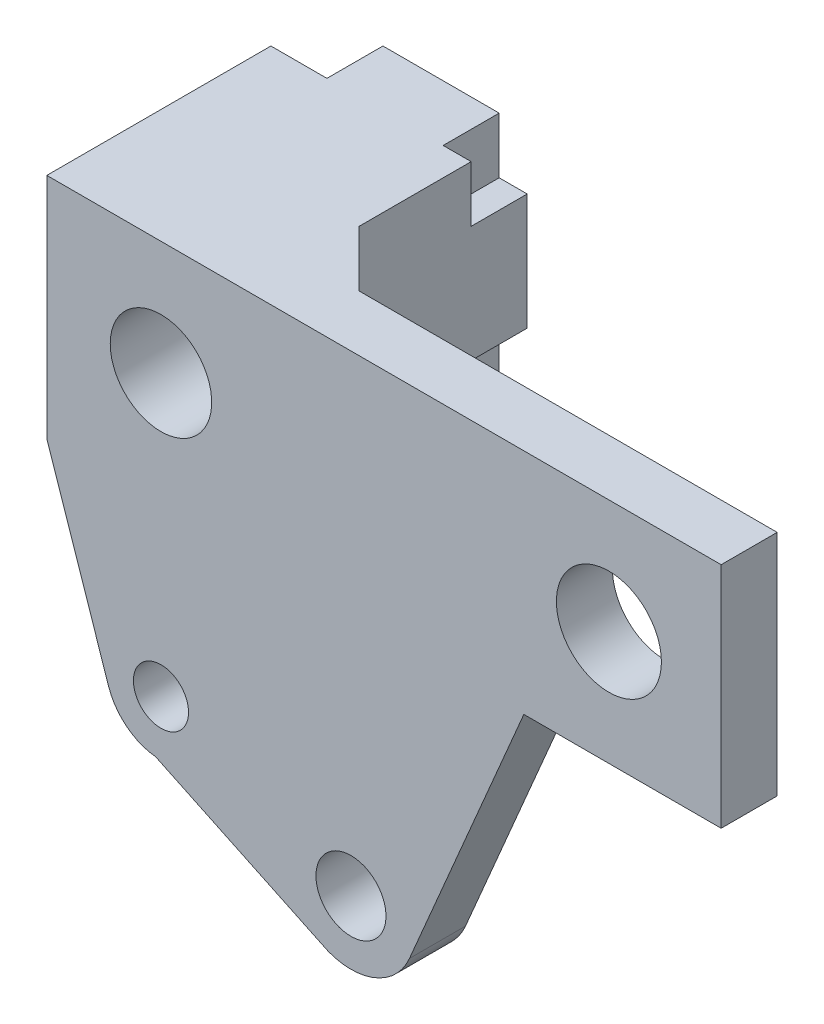
ISO-10303-21;
HEADER;
FILE_DESCRIPTION(('STEP AP214'),'2;1');
FILE_NAME('part.step','',(''),(''),'','','');
FILE_SCHEMA(('AUTOMOTIVE_DESIGN { 1 0 10303 214 1 1 1 1 }'));
ENDSEC;
DATA;
#1=APPLICATION_CONTEXT('core data for automotive mechanical design processes');
#2=APPLICATION_PROTOCOL_DEFINITION('international standard','automotive_design',2000,#1);
#3=PRODUCT_CONTEXT('',#1,'mechanical');
#4=PRODUCT('Part','Part','',(#3));
#5=PRODUCT_RELATED_PRODUCT_CATEGORY('part','',(#4));
#6=PRODUCT_DEFINITION_FORMATION('','',#4);
#7=PRODUCT_DEFINITION_CONTEXT('part definition',#1,'design');
#8=PRODUCT_DEFINITION('design','',#6,#7);
#9=PRODUCT_DEFINITION_SHAPE('','',#8);
#10=(LENGTH_UNIT() NAMED_UNIT(*) SI_UNIT(.MILLI.,.METRE.));
#11=(NAMED_UNIT(*) PLANE_ANGLE_UNIT() SI_UNIT($,.RADIAN.));
#12=(NAMED_UNIT(*) SI_UNIT($,.STERADIAN.) SOLID_ANGLE_UNIT());
#13=UNCERTAINTY_MEASURE_WITH_UNIT(LENGTH_MEASURE(1.E-05),#10,'distance_accuracy_value','');
#14=(GEOMETRIC_REPRESENTATION_CONTEXT(3) GLOBAL_UNCERTAINTY_ASSIGNED_CONTEXT((#13)) GLOBAL_UNIT_ASSIGNED_CONTEXT((#10,
#11,#12)) REPRESENTATION_CONTEXT('',''));
#15=CARTESIAN_POINT('',(0.,0.,0.));
#16=DIRECTION('',(0.,0.,1.));
#17=DIRECTION('',(1.,0.,0.));
#18=AXIS2_PLACEMENT_3D('',#15,#16,#17);
#19=CARTESIAN_POINT('',(0.,0.,0.));
#20=DIRECTION('',(0.,1.,0.));
#21=DIRECTION('',(0.,0.,1.));
#22=AXIS2_PLACEMENT_3D('',#19,#20,#21);
#23=PLANE('',#22);
#24=DIRECTION('',(1.,0.,0.));
#25=VECTOR('',#24,1.);
#26=CARTESIAN_POINT('',(0.,0.,0.));
#27=LINE('',#26,#25);
#28=CARTESIAN_POINT('',(43.2595043201598,0.,0.));
#29=VERTEX_POINT('',#28);
#30=CARTESIAN_POINT('',(61.1505,0.,0.));
#31=VERTEX_POINT('',#30);
#32=EDGE_CURVE('E210',#29,#31,#27,.T.);
#33=ORIENTED_EDGE('',*,*,#32,.F.);
#34=DIRECTION('',(0.,0.,1.));
#35=VECTOR('',#34,1.);
#36=CARTESIAN_POINT('',(43.2595043201598,0.,-5.08));
#37=LINE('',#36,#35);
#38=CARTESIAN_POINT('',(43.2595043201598,0.,-5.07999999999999));
#39=VERTEX_POINT('',#38);
#40=EDGE_CURVE('E254',#39,#29,#37,.T.);
#41=ORIENTED_EDGE('',*,*,#40,.F.);
#42=DIRECTION('',(-1.,0.,0.));
#43=VECTOR('',#42,1.);
#44=CARTESIAN_POINT('',(0.,0.,-5.07999999999999));
#45=LINE('',#44,#43);
#46=CARTESIAN_POINT('',(61.1505,0.,-5.08));
#47=VERTEX_POINT('',#46);
#48=EDGE_CURVE('E403',#47,#39,#45,.T.);
#49=ORIENTED_EDGE('',*,*,#48,.F.);
#50=DIRECTION('',(0.,0.,1.));
#51=VECTOR('',#50,1.);
#52=CARTESIAN_POINT('',(61.1505,0.,0.));
#53=LINE('',#52,#51);
#54=EDGE_CURVE('E225',#47,#31,#53,.T.);
#55=ORIENTED_EDGE('',*,*,#54,.T.);
#56=EDGE_LOOP('',(#33,#41,#49,#55));
#57=FACE_BOUND('',#56,.T.);
#58=ADVANCED_FACE('F39',(#57),#23,.F.);
#59=DIRECTION('',(1.,0.,0.));
#60=VECTOR('',#59,1.);
#61=CARTESIAN_POINT('',(0.,0.,-5.08));
#62=LINE('',#61,#60);
#63=CARTESIAN_POINT('',(0.,0.,-5.08));
#64=VERTEX_POINT('',#63);
#65=CARTESIAN_POINT('',(23.241,0.,-5.07999999999999));
#66=VERTEX_POINT('',#65);
#67=EDGE_CURVE('E368',#64,#66,#62,.T.);
#68=ORIENTED_EDGE('',*,*,#67,.F.);
#69=DIRECTION('',(0.,0.,-1.));
#70=VECTOR('',#69,1.);
#71=CARTESIAN_POINT('',(0.,0.,0.));
#72=LINE('',#71,#70);
#73=CARTESIAN_POINT('',(0.,0.,-20.32));
#74=VERTEX_POINT('',#73);
#75=EDGE_CURVE('E409',#64,#74,#72,.T.);
#76=ORIENTED_EDGE('',*,*,#75,.T.);
#77=DIRECTION('',(-1.,0.,0.));
#78=VECTOR('',#77,1.);
#79=CARTESIAN_POINT('',(0.,0.,-20.32));
#80=LINE('',#79,#78);
#81=CARTESIAN_POINT('',(5.08,0.,-20.32));
#82=VERTEX_POINT('',#81);
#83=EDGE_CURVE('E354',#82,#74,#80,.T.);
#84=ORIENTED_EDGE('',*,*,#83,.F.);
#85=DIRECTION('',(0.,0.,-1.));
#86=VECTOR('',#85,1.);
#87=CARTESIAN_POINT('',(5.08,0.,-20.32));
#88=LINE('',#87,#86);
#89=CARTESIAN_POINT('',(5.08,0.,-25.4));
#90=VERTEX_POINT('',#89);
#91=EDGE_CURVE('E357',#82,#90,#88,.T.);
#92=ORIENTED_EDGE('',*,*,#91,.T.);
#93=DIRECTION('',(1.,0.,0.));
#94=VECTOR('',#93,1.);
#95=CARTESIAN_POINT('',(0.,0.,-25.4));
#96=LINE('',#95,#94);
#97=CARTESIAN_POINT('',(15.621,0.,-25.4));
#98=VERTEX_POINT('',#97);
#99=EDGE_CURVE('E396',#90,#98,#96,.T.);
#100=ORIENTED_EDGE('',*,*,#99,.T.);
#101=DIRECTION('',(0.,0.,-1.));
#102=VECTOR('',#101,1.);
#103=CARTESIAN_POINT('',(15.621,0.,-20.32));
#104=LINE('',#103,#102);
#105=CARTESIAN_POINT('',(15.621,0.,-20.32));
#106=VERTEX_POINT('',#105);
#107=EDGE_CURVE('E322',#106,#98,#104,.T.);
#108=ORIENTED_EDGE('',*,*,#107,.F.);
#109=DIRECTION('',(-1.,0.,0.));
#110=VECTOR('',#109,1.);
#111=CARTESIAN_POINT('',(20.701,0.,-20.32));
#112=LINE('',#111,#110);
#113=CARTESIAN_POINT('',(18.161,0.,-20.32));
#114=VERTEX_POINT('',#113);
#115=EDGE_CURVE('E327',#114,#106,#112,.T.);
#116=ORIENTED_EDGE('',*,*,#115,.F.);
#117=DIRECTION('',(0.,0.,1.));
#118=VECTOR('',#117,1.);
#119=CARTESIAN_POINT('',(18.161,0.,-10.16));
#120=LINE('',#119,#118);
#121=CARTESIAN_POINT('',(18.161,0.,-10.16));
#122=VERTEX_POINT('',#121);
#123=EDGE_CURVE('E265',#114,#122,#120,.T.);
#124=ORIENTED_EDGE('',*,*,#123,.T.);
#125=DIRECTION('',(0.707106781186548,0.,0.707106781186548));
#126=VECTOR('',#125,1.);
#127=CARTESIAN_POINT('',(14.1605,0.,-14.1605));
#128=LINE('',#127,#126);
#129=EDGE_CURVE('E262',#122,#66,#128,.T.);
#130=ORIENTED_EDGE('',*,*,#129,.T.);
#131=EDGE_LOOP('',(#68,#76,#84,#92,#100,#108,#116,#124,#130));
#132=FACE_BOUND('',#131,.T.);
#133=ADVANCED_FACE('F432',(#132),#23,.F.);
#134=CARTESIAN_POINT('',(10.3505,-15.0495,-5.08));
#135=DIRECTION('',(0.,0.,1.));
#136=DIRECTION('',(1.,0.,0.));
#137=AXIS2_PLACEMENT_3D('',#134,#135,#136);
#138=CYLINDRICAL_SURFACE('',#137,5.00005610881882);
#139=DIRECTION('',(0.,0.,1.));
#140=VECTOR('',#139,1.);
#141=CARTESIAN_POINT('',(9.86423446494643,-20.0258547824442,-5.08));
#142=LINE('',#141,#140);
#143=CARTESIAN_POINT('',(9.86423446494643,-20.0258547824442,-5.08));
#144=VERTEX_POINT('',#143);
#145=CARTESIAN_POINT('',(9.86423446494643,-20.0258547824442,0.));
#146=VERTEX_POINT('',#145);
#147=EDGE_CURVE('E241',#144,#146,#142,.T.);
#148=ORIENTED_EDGE('',*,*,#147,.T.);
#149=CARTESIAN_POINT('',(10.3505,-15.0495,0.));
#150=DIRECTION('',(0.,0.,1.));
#151=DIRECTION('',(1.,0.,0.));
#152=AXIS2_PLACEMENT_3D('',#149,#150,#151);
#153=CIRCLE('',#152,5.00005610881882);
#154=CARTESIAN_POINT('',(5.61248093428256,-16.6469155452588,0.));
#155=VERTEX_POINT('',#154);
#156=EDGE_CURVE('E382',#146,#155,#153,.F.);
#157=ORIENTED_EDGE('',*,*,#156,.T.);
#158=DIRECTION('',(0.,0.,1.));
#159=VECTOR('',#158,1.);
#160=CARTESIAN_POINT('',(5.61248093428256,-16.6469155452588,-5.08));
#161=LINE('',#160,#159);
#162=CARTESIAN_POINT('',(5.61248093428256,-16.6469155452588,-5.08));
#163=VERTEX_POINT('',#162);
#164=EDGE_CURVE('E380',#163,#155,#161,.T.);
#165=ORIENTED_EDGE('',*,*,#164,.F.);
#166=CARTESIAN_POINT('',(10.3505,-15.0495,-5.08));
#167=DIRECTION('',(0.,0.,1.));
#168=DIRECTION('',(1.,0.,0.));
#169=AXIS2_PLACEMENT_3D('',#166,#167,#168);
#170=CIRCLE('',#169,5.00005610881882);
#171=EDGE_CURVE('E374',#144,#163,#170,.F.);
#172=ORIENTED_EDGE('',*,*,#171,.F.);
#173=EDGE_LOOP('',(#148,#157,#165,#172));
#174=FACE_BOUND('',#173,.T.);
#175=ADVANCED_FACE('F509',(#174),#138,.T.);
#176=CARTESIAN_POINT('',(0.,20.701,0.));
#177=DIRECTION('',(0.,1.,0.));
#178=DIRECTION('',(0.,0.,1.));
#179=AXIS2_PLACEMENT_3D('',#176,#177,#178);
#180=PLANE('',#179);
#181=DIRECTION('',(0.,0.,1.));
#182=VECTOR('',#181,1.);
#183=CARTESIAN_POINT('',(61.1505,20.701,0.));
#184=LINE('',#183,#182);
#185=CARTESIAN_POINT('',(61.1505,20.701,-5.08));
#186=VERTEX_POINT('',#185);
#187=CARTESIAN_POINT('',(61.1505,20.701,0.));
#188=VERTEX_POINT('',#187);
#189=EDGE_CURVE('E213',#186,#188,#184,.T.);
#190=ORIENTED_EDGE('',*,*,#189,.F.);
#191=DIRECTION('',(-1.,0.,0.));
#192=VECTOR('',#191,1.);
#193=CARTESIAN_POINT('',(0.,20.701,-5.07999999999999));
#194=LINE('',#193,#192);
#195=CARTESIAN_POINT('',(23.241,20.701,-5.07999999999999));
#196=VERTEX_POINT('',#195);
#197=EDGE_CURVE('E222',#186,#196,#194,.T.);
#198=ORIENTED_EDGE('',*,*,#197,.T.);
#199=DIRECTION('',(0.707106781186548,0.,0.707106781186548));
#200=VECTOR('',#199,1.);
#201=CARTESIAN_POINT('',(-11.2395,20.701,-39.5605));
#202=LINE('',#201,#200);
#203=CARTESIAN_POINT('',(18.161,20.701,-10.16));
#204=VERTEX_POINT('',#203);
#205=EDGE_CURVE('E251',#204,#196,#202,.T.);
#206=ORIENTED_EDGE('',*,*,#205,.F.);
#207=DIRECTION('',(0.,0.,1.));
#208=VECTOR('',#207,1.);
#209=CARTESIAN_POINT('',(18.161,20.701,-10.16));
#210=LINE('',#209,#208);
#211=CARTESIAN_POINT('',(18.161,20.701,-20.32));
#212=VERTEX_POINT('',#211);
#213=EDGE_CURVE('E266',#212,#204,#210,.T.);
#214=ORIENTED_EDGE('',*,*,#213,.F.);
#215=DIRECTION('',(1.,0.,0.));
#216=VECTOR('',#215,1.);
#217=CARTESIAN_POINT('',(20.701,20.701,-20.32));
#218=LINE('',#217,#216);
#219=CARTESIAN_POINT('',(15.621,20.701,-20.32));
#220=VERTEX_POINT('',#219);
#221=EDGE_CURVE('E315',#220,#212,#218,.T.);
#222=ORIENTED_EDGE('',*,*,#221,.F.);
#223=DIRECTION('',(0.,0.,-1.));
#224=VECTOR('',#223,1.);
#225=CARTESIAN_POINT('',(15.621,20.701,-20.32));
#226=LINE('',#225,#224);
#227=CARTESIAN_POINT('',(15.621,20.701,-25.4));
#228=VERTEX_POINT('',#227);
#229=EDGE_CURVE('E318',#220,#228,#226,.T.);
#230=ORIENTED_EDGE('',*,*,#229,.T.);
#231=DIRECTION('',(1.,0.,0.));
#232=VECTOR('',#231,1.);
#233=CARTESIAN_POINT('',(0.,20.701,-25.4));
#234=LINE('',#233,#232);
#235=CARTESIAN_POINT('',(5.08,20.701,-25.4));
#236=VERTEX_POINT('',#235);
#237=EDGE_CURVE('E400',#236,#228,#234,.T.);
#238=ORIENTED_EDGE('',*,*,#237,.F.);
#239=DIRECTION('',(0.,0.,-1.));
#240=VECTOR('',#239,1.);
#241=CARTESIAN_POINT('',(5.08,20.701,-20.32));
#242=LINE('',#241,#240);
#243=CARTESIAN_POINT('',(5.08,20.701,-20.32));
#244=VERTEX_POINT('',#243);
#245=EDGE_CURVE('E305',#244,#236,#242,.T.);
#246=ORIENTED_EDGE('',*,*,#245,.F.);
#247=DIRECTION('',(1.,0.,0.));
#248=VECTOR('',#247,1.);
#249=CARTESIAN_POINT('',(0.,20.701,-20.32));
#250=LINE('',#249,#248);
#251=CARTESIAN_POINT('',(0.,20.701,-20.32));
#252=VERTEX_POINT('',#251);
#253=EDGE_CURVE('E286',#252,#244,#250,.T.);
#254=ORIENTED_EDGE('',*,*,#253,.F.);
#255=DIRECTION('',(0.,0.,-1.));
#256=VECTOR('',#255,1.);
#257=CARTESIAN_POINT('',(0.,20.701,0.));
#258=LINE('',#257,#256);
#259=CARTESIAN_POINT('',(0.,20.701,0.));
#260=VERTEX_POINT('',#259);
#261=EDGE_CURVE('E221',#260,#252,#258,.T.);
#262=ORIENTED_EDGE('',*,*,#261,.F.);
#263=DIRECTION('',(1.,0.,0.));
#264=VECTOR('',#263,1.);
#265=CARTESIAN_POINT('',(0.,20.701,0.));
#266=LINE('',#265,#264);
#267=EDGE_CURVE('E207',#260,#188,#266,.T.);
#268=ORIENTED_EDGE('',*,*,#267,.T.);
#269=EDGE_LOOP('',(#190,#198,#206,#214,#222,#230,#238,#246,#254,#262,#268));
#270=FACE_BOUND('',#269,.T.);
#271=ADVANCED_FACE('F217',(#270),#180,.T.);
#272=CARTESIAN_POINT('',(0.,20.701,-25.4));
#273=DIRECTION('',(0.,0.,-1.));
#274=DIRECTION('',(-1.,0.,0.));
#275=AXIS2_PLACEMENT_3D('',#272,#273,#274);
#276=PLANE('',#275);
#277=DIRECTION('',(0.,-1.,0.));
#278=VECTOR('',#277,1.);
#279=CARTESIAN_POINT('',(18.161,20.701,-25.4));
#280=LINE('',#279,#278);
#281=CARTESIAN_POINT('',(18.161,15.621,-25.4));
#282=VERTEX_POINT('',#281);
#283=CARTESIAN_POINT('',(18.161,5.08,-25.4));
#284=VERTEX_POINT('',#283);
#285=EDGE_CURVE('E276',#282,#284,#280,.T.);
#286=ORIENTED_EDGE('',*,*,#285,.T.);
#287=DIRECTION('',(1.,0.,0.));
#288=VECTOR('',#287,1.);
#289=CARTESIAN_POINT('',(20.701,5.08,-25.4));
#290=LINE('',#289,#288);
#291=CARTESIAN_POINT('',(15.621,5.08,-25.4));
#292=VERTEX_POINT('',#291);
#293=EDGE_CURVE('E331',#292,#284,#290,.T.);
#294=ORIENTED_EDGE('',*,*,#293,.F.);
#295=DIRECTION('',(0.,1.,0.));
#296=VECTOR('',#295,1.);
#297=CARTESIAN_POINT('',(15.621,0.,-25.4));
#298=LINE('',#297,#296);
#299=EDGE_CURVE('E283',#98,#292,#298,.T.);
#300=ORIENTED_EDGE('',*,*,#299,.F.);
#301=ORIENTED_EDGE('',*,*,#99,.F.);
#302=DIRECTION('',(0.,-1.,0.));
#303=VECTOR('',#302,1.);
#304=CARTESIAN_POINT('',(5.08,0.,-25.4));
#305=LINE('',#304,#303);
#306=CARTESIAN_POINT('',(5.08,5.08,-25.4));
#307=VERTEX_POINT('',#306);
#308=EDGE_CURVE('E349',#307,#90,#305,.T.);
#309=ORIENTED_EDGE('',*,*,#308,.F.);
#310=DIRECTION('',(1.,0.,0.));
#311=VECTOR('',#310,1.);
#312=CARTESIAN_POINT('',(0.,5.08,-25.4));
#313=LINE('',#312,#311);
#314=CARTESIAN_POINT('',(0.,5.08,-25.4));
#315=VERTEX_POINT('',#314);
#316=EDGE_CURVE('E308',#315,#307,#313,.T.);
#317=ORIENTED_EDGE('',*,*,#316,.F.);
#318=DIRECTION('',(0.,-1.,0.));
#319=VECTOR('',#318,1.);
#320=CARTESIAN_POINT('',(0.,20.701,-25.4));
#321=LINE('',#320,#319);
#322=CARTESIAN_POINT('',(0.,15.621,-25.4));
#323=VERTEX_POINT('',#322);
#324=EDGE_CURVE('E417',#323,#315,#321,.T.);
#325=ORIENTED_EDGE('',*,*,#324,.F.);
#326=DIRECTION('',(-1.,0.,0.));
#327=VECTOR('',#326,1.);
#328=CARTESIAN_POINT('',(0.,15.621,-25.4));
#329=LINE('',#328,#327);
#330=CARTESIAN_POINT('',(5.08,15.621,-25.4));
#331=VERTEX_POINT('',#330);
#332=EDGE_CURVE('E287',#331,#323,#329,.T.);
#333=ORIENTED_EDGE('',*,*,#332,.F.);
#334=DIRECTION('',(0.,-1.,0.));
#335=VECTOR('',#334,1.);
#336=CARTESIAN_POINT('',(5.08,20.701,-25.4));
#337=LINE('',#336,#335);
#338=EDGE_CURVE('E296',#236,#331,#337,.T.);
#339=ORIENTED_EDGE('',*,*,#338,.F.);
#340=ORIENTED_EDGE('',*,*,#237,.T.);
#341=DIRECTION('',(0.,1.,0.));
#342=VECTOR('',#341,1.);
#343=CARTESIAN_POINT('',(15.621,20.701,-25.4));
#344=LINE('',#343,#342);
#345=CARTESIAN_POINT('',(15.621,15.621,-25.4));
#346=VERTEX_POINT('',#345);
#347=EDGE_CURVE('E313',#346,#228,#344,.T.);
#348=ORIENTED_EDGE('',*,*,#347,.F.);
#349=DIRECTION('',(-1.,0.,0.));
#350=VECTOR('',#349,1.);
#351=CARTESIAN_POINT('',(20.701,15.621,-25.4));
#352=LINE('',#351,#350);
#353=EDGE_CURVE('E319',#282,#346,#352,.T.);
#354=ORIENTED_EDGE('',*,*,#353,.F.);
#355=EDGE_LOOP('',(#286,#294,#300,#301,#309,#317,#325,#333,#339,#340,#348,#354));
#356=FACE_BOUND('',#355,.T.);
#357=CARTESIAN_POINT('',(10.3505,10.3505,-25.4));
#358=DIRECTION('',(0.,0.,-1.));
#359=DIRECTION('',(-1.,0.,0.));
#360=AXIS2_PLACEMENT_3D('',#357,#358,#359);
#361=CIRCLE('',#360,4.6);
#362=CARTESIAN_POINT('',(5.7505,10.3505,-25.4));
#363=VERTEX_POINT('',#362);
#364=EDGE_CURVE('E397',#363,#363,#361,.T.);
#365=ORIENTED_EDGE('',*,*,#364,.F.);
#366=EDGE_LOOP('',(#365));
#367=FACE_BOUND('',#366,.T.);
#368=ADVANCED_FACE('F41',(#356,#367),#276,.T.);
#369=CARTESIAN_POINT('',(0.,20.701,0.));
#370=DIRECTION('',(-1.,0.,0.));
#371=DIRECTION('',(0.,0.,1.));
#372=AXIS2_PLACEMENT_3D('',#369,#370,#371);
#373=PLANE('',#372);
#374=ORIENTED_EDGE('',*,*,#324,.T.);
#375=DIRECTION('',(0.,0.,-1.));
#376=VECTOR('',#375,1.);
#377=CARTESIAN_POINT('',(0.,5.08,-20.32));
#378=LINE('',#377,#376);
#379=CARTESIAN_POINT('',(0.,5.08,-20.32));
#380=VERTEX_POINT('',#379);
#381=EDGE_CURVE('E365',#380,#315,#378,.T.);
#382=ORIENTED_EDGE('',*,*,#381,.F.);
#383=DIRECTION('',(0.,1.,0.));
#384=VECTOR('',#383,1.);
#385=CARTESIAN_POINT('',(0.,0.,-20.32));
#386=LINE('',#385,#384);
#387=EDGE_CURVE('E345',#74,#380,#386,.T.);
#388=ORIENTED_EDGE('',*,*,#387,.F.);
#389=ORIENTED_EDGE('',*,*,#75,.F.);
#390=CARTESIAN_POINT('',(0.,0.,0.));
#391=VERTEX_POINT('',#390);
#392=EDGE_CURVE('E410',#391,#64,#72,.T.);
#393=ORIENTED_EDGE('',*,*,#392,.F.);
#394=DIRECTION('',(0.,-1.,0.));
#395=VECTOR('',#394,1.);
#396=CARTESIAN_POINT('',(0.,20.701,0.));
#397=LINE('',#396,#395);
#398=EDGE_CURVE('E406',#260,#391,#397,.T.);
#399=ORIENTED_EDGE('',*,*,#398,.F.);
#400=ORIENTED_EDGE('',*,*,#261,.T.);
#401=DIRECTION('',(0.,1.,0.));
#402=VECTOR('',#401,1.);
#403=CARTESIAN_POINT('',(0.,20.701,-20.32));
#404=LINE('',#403,#402);
#405=CARTESIAN_POINT('',(0.,15.621,-20.32));
#406=VERTEX_POINT('',#405);
#407=EDGE_CURVE('E284',#406,#252,#404,.T.);
#408=ORIENTED_EDGE('',*,*,#407,.F.);
#409=DIRECTION('',(0.,0.,-1.));
#410=VECTOR('',#409,1.);
#411=CARTESIAN_POINT('',(0.,15.621,-20.32));
#412=LINE('',#411,#410);
#413=EDGE_CURVE('E295',#406,#323,#412,.T.);
#414=ORIENTED_EDGE('',*,*,#413,.T.);
#415=EDGE_LOOP('',(#374,#382,#388,#389,#393,#399,#400,#408,#414));
#416=FACE_BOUND('',#415,.T.);
#417=ADVANCED_FACE('F468',(#416),#373,.T.);
#418=CARTESIAN_POINT('',(0.,20.701,0.));
#419=DIRECTION('',(0.,0.,-1.));
#420=DIRECTION('',(-1.,0.,0.));
#421=AXIS2_PLACEMENT_3D('',#418,#419,#420);
#422=PLANE('',#421);
#423=ORIENTED_EDGE('',*,*,#267,.F.);
#424=ORIENTED_EDGE('',*,*,#398,.T.);
#425=DIRECTION('',(0.319479523928011,-0.947593179476684,0.));
#426=VECTOR('',#425,1.);
#427=CARTESIAN_POINT('',(0.,0.,0.));
#428=LINE('',#427,#426);
#429=EDGE_CURVE('E367',#391,#155,#428,.T.);
#430=ORIENTED_EDGE('',*,*,#429,.T.);
#431=ORIENTED_EDGE('',*,*,#156,.F.);
#432=DIRECTION('',(0.902829131276005,-0.429999488045525,0.));
#433=VECTOR('',#432,1.);
#434=CARTESIAN_POINT('',(-5.95046591717002,-12.4936287694308,0.));
#435=LINE('',#434,#433);
#436=CARTESIAN_POINT('',(25.5135014565367,-27.4792881748304,0.));
#437=VERTEX_POINT('',#436);
#438=EDGE_CURVE('E212',#146,#437,#435,.T.);
#439=ORIENTED_EDGE('',*,*,#438,.T.);
#440=CARTESIAN_POINT('',(27.580941282,-22.098,0.));
#441=DIRECTION('',(0.,0.,-1.));
#442=DIRECTION('',(-1.,0.,0.));
#443=AXIS2_PLACEMENT_3D('',#440,#441,#442);
#444=CIRCLE('',#443,5.76476971374234);
#445=CARTESIAN_POINT('',(32.8846235947898,-24.3570980008583,0.));
#446=VERTEX_POINT('',#445);
#447=EDGE_CURVE('E245',#437,#446,#444,.F.);
#448=ORIENTED_EDGE('',*,*,#447,.T.);
#449=DIRECTION('',(0.391880007881832,0.920016336497638,0.));
#450=VECTOR('',#449,1.);
#451=CARTESIAN_POINT('',(36.6161448123023,-15.5966090474787,0.));
#452=LINE('',#451,#450);
#453=EDGE_CURVE('E60',#446,#29,#452,.T.);
#454=ORIENTED_EDGE('',*,*,#453,.T.);
#455=ORIENTED_EDGE('',*,*,#32,.T.);
#456=DIRECTION('',(0.,-1.,0.));
#457=VECTOR('',#456,1.);
#458=CARTESIAN_POINT('',(61.1505,20.701,0.));
#459=LINE('',#458,#457);
#460=EDGE_CURVE('E202',#188,#31,#459,.T.);
#461=ORIENTED_EDGE('',*,*,#460,.F.);
#462=EDGE_LOOP('',(#423,#424,#430,#431,#439,#448,#454,#455,#461));
#463=FACE_BOUND('',#462,.T.);
#464=CARTESIAN_POINT('',(50.970999912,10.3505,0.));
#465=DIRECTION('',(0.,0.,1.));
#466=DIRECTION('',(1.,0.,0.));
#467=AXIS2_PLACEMENT_3D('',#464,#465,#466);
#468=CIRCLE('',#467,4.7625);
#469=CARTESIAN_POINT('',(55.733499912,10.3505,0.));
#470=VERTEX_POINT('',#469);
#471=EDGE_CURVE('E389',#470,#470,#468,.T.);
#472=ORIENTED_EDGE('',*,*,#471,.F.);
#473=EDGE_LOOP('',(#472));
#474=FACE_BOUND('',#473,.T.);
#475=CARTESIAN_POINT('',(10.3505,10.3505,0.));
#476=DIRECTION('',(0.,0.,-1.));
#477=DIRECTION('',(-1.,0.,0.));
#478=AXIS2_PLACEMENT_3D('',#475,#476,#477);
#479=CIRCLE('',#478,4.6);
#480=CARTESIAN_POINT('',(5.7505,10.3505,0.));
#481=VERTEX_POINT('',#480);
#482=EDGE_CURVE('E393',#481,#481,#479,.T.);
#483=ORIENTED_EDGE('',*,*,#482,.T.);
#484=EDGE_LOOP('',(#483));
#485=FACE_BOUND('',#484,.T.);
#486=CARTESIAN_POINT('',(10.3505,-15.0495,0.));
#487=DIRECTION('',(0.,0.,1.));
#488=DIRECTION('',(1.,0.,0.));
#489=AXIS2_PLACEMENT_3D('',#486,#487,#488);
#490=CIRCLE('',#489,2.5);
#491=CARTESIAN_POINT('',(12.8505,-15.0495,0.));
#492=VERTEX_POINT('',#491);
#493=EDGE_CURVE('E372',#492,#492,#490,.T.);
#494=ORIENTED_EDGE('',*,*,#493,.F.);
#495=EDGE_LOOP('',(#494));
#496=FACE_BOUND('',#495,.T.);
#497=CARTESIAN_POINT('',(27.580941282,-22.098,0.));
#498=DIRECTION('',(0.,0.,-1.));
#499=DIRECTION('',(-1.,0.,0.));
#500=AXIS2_PLACEMENT_3D('',#497,#498,#499);
#501=CIRCLE('',#500,3.175);
#502=CARTESIAN_POINT('',(24.405941282,-22.098,0.));
#503=VERTEX_POINT('',#502);
#504=EDGE_CURVE('E233',#503,#503,#501,.T.);
#505=ORIENTED_EDGE('',*,*,#504,.T.);
#506=EDGE_LOOP('',(#505));
#507=FACE_BOUND('',#506,.T.);
#508=ADVANCED_FACE('F204',(#463,#474,#485,#496,#507),#422,.F.);
#509=CARTESIAN_POINT('',(0.,20.701,-5.07999999999999));
#510=DIRECTION('',(0.,0.,1.));
#511=DIRECTION('',(1.,0.,0.));
#512=AXIS2_PLACEMENT_3D('',#509,#510,#511);
#513=PLANE('',#512);
#514=CARTESIAN_POINT('',(50.970999912,10.3505,-5.07999999999999));
#515=DIRECTION('',(0.,0.,1.));
#516=DIRECTION('',(1.,0.,0.));
#517=AXIS2_PLACEMENT_3D('',#514,#515,#516);
#518=CIRCLE('',#517,4.7625);
#519=CARTESIAN_POINT('',(55.733499912,10.3505,-5.07999999999999));
#520=VERTEX_POINT('',#519);
#521=EDGE_CURVE('E392',#520,#520,#518,.T.);
#522=ORIENTED_EDGE('',*,*,#521,.T.);
#523=EDGE_LOOP('',(#522));
#524=FACE_BOUND('',#523,.T.);
#525=ORIENTED_EDGE('',*,*,#48,.T.);
#526=DIRECTION('',(0.391880007881832,0.920016336497638,0.));
#527=VECTOR('',#526,1.);
#528=CARTESIAN_POINT('',(36.6161448123023,-15.5966090474787,-5.08));
#529=LINE('',#528,#527);
#530=CARTESIAN_POINT('',(32.8846235947898,-24.3570980008583,-5.08));
#531=VERTEX_POINT('',#530);
#532=EDGE_CURVE('E232',#531,#39,#529,.T.);
#533=ORIENTED_EDGE('',*,*,#532,.F.);
#534=CARTESIAN_POINT('',(27.580941282,-22.098,-5.08));
#535=DIRECTION('',(0.,0.,-1.));
#536=DIRECTION('',(-1.,0.,0.));
#537=AXIS2_PLACEMENT_3D('',#534,#535,#536);
#538=CIRCLE('',#537,5.76476971374234);
#539=CARTESIAN_POINT('',(25.5135014565367,-27.4792881748304,-5.08));
#540=VERTEX_POINT('',#539);
#541=EDGE_CURVE('E235',#540,#531,#538,.F.);
#542=ORIENTED_EDGE('',*,*,#541,.F.);
#543=DIRECTION('',(0.902829131276005,-0.429999488045525,0.));
#544=VECTOR('',#543,1.);
#545=CARTESIAN_POINT('',(-5.95046591717002,-12.4936287694308,-5.08));
#546=LINE('',#545,#544);
#547=EDGE_CURVE('E229',#144,#540,#546,.T.);
#548=ORIENTED_EDGE('',*,*,#547,.F.);
#549=ORIENTED_EDGE('',*,*,#171,.T.);
#550=DIRECTION('',(0.319479523928011,-0.947593179476684,0.));
#551=VECTOR('',#550,1.);
#552=CARTESIAN_POINT('',(0.,0.,-5.08));
#553=LINE('',#552,#551);
#554=EDGE_CURVE('E371',#64,#163,#553,.T.);
#555=ORIENTED_EDGE('',*,*,#554,.F.);
#556=ORIENTED_EDGE('',*,*,#67,.T.);
#557=DIRECTION('',(0.,1.,0.));
#558=VECTOR('',#557,1.);
#559=CARTESIAN_POINT('',(23.241,-20.0495561088188,-5.07999999999999));
#560=LINE('',#559,#558);
#561=EDGE_CURVE('E260',#66,#196,#560,.T.);
#562=ORIENTED_EDGE('',*,*,#561,.T.);
#563=ORIENTED_EDGE('',*,*,#197,.F.);
#564=DIRECTION('',(0.,1.,0.));
#565=VECTOR('',#564,1.);
#566=CARTESIAN_POINT('',(61.1505,20.701,-5.08));
#567=LINE('',#566,#565);
#568=EDGE_CURVE('E11',#47,#186,#567,.T.);
#569=ORIENTED_EDGE('',*,*,#568,.F.);
#570=EDGE_LOOP('',(#525,#533,#542,#548,#549,#555,#556,#562,#563,#569));
#571=FACE_BOUND('',#570,.T.);
#572=CARTESIAN_POINT('',(10.3505,-15.0495,-5.08));
#573=DIRECTION('',(0.,0.,1.));
#574=DIRECTION('',(1.,0.,0.));
#575=AXIS2_PLACEMENT_3D('',#572,#573,#574);
#576=CIRCLE('',#575,2.5);
#577=CARTESIAN_POINT('',(12.8505,-15.0495,-5.08));
#578=VERTEX_POINT('',#577);
#579=EDGE_CURVE('E377',#578,#578,#576,.T.);
#580=ORIENTED_EDGE('',*,*,#579,.T.);
#581=EDGE_LOOP('',(#580));
#582=FACE_BOUND('',#581,.T.);
#583=CARTESIAN_POINT('',(27.580941282,-22.098,-5.08));
#584=DIRECTION('',(0.,0.,-1.));
#585=DIRECTION('',(-1.,0.,0.));
#586=AXIS2_PLACEMENT_3D('',#583,#584,#585);
#587=CIRCLE('',#586,3.175);
#588=CARTESIAN_POINT('',(24.405941282,-22.098,-5.08));
#589=VERTEX_POINT('',#588);
#590=EDGE_CURVE('E238',#589,#589,#587,.T.);
#591=ORIENTED_EDGE('',*,*,#590,.F.);
#592=EDGE_LOOP('',(#591));
#593=FACE_BOUND('',#592,.T.);
#594=ADVANCED_FACE('F459',(#524,#571,#582,#593),#513,.F.);
#595=CARTESIAN_POINT('',(10.3505,10.3505,0.));
#596=DIRECTION('',(0.,0.,-1.));
#597=DIRECTION('',(-1.,0.,0.));
#598=AXIS2_PLACEMENT_3D('',#595,#596,#597);
#599=CYLINDRICAL_SURFACE('',#598,4.6);
#600=CARTESIAN_POINT('',(5.7505,10.3505,0.));
#601=CARTESIAN_POINT('',(5.7505,10.3505,-0.264583333333333));
#602=CARTESIAN_POINT('',(5.7505,10.3505,-0.529166666666667));
#603=CARTESIAN_POINT('',(5.7505,10.3505,-1.05833333333333));
#604=CARTESIAN_POINT('',(5.7505,10.3505,-1.32291666666667));
#605=CARTESIAN_POINT('',(5.7505,10.3505,-1.85208333333333));
#606=CARTESIAN_POINT('',(5.7505,10.3505,-2.11666666666667));
#607=CARTESIAN_POINT('',(5.7505,10.3505,-2.64583333333333));
#608=CARTESIAN_POINT('',(5.7505,10.3505,-2.91041666666667));
#609=CARTESIAN_POINT('',(5.7505,10.3505,-3.43958333333333));
#610=CARTESIAN_POINT('',(5.7505,10.3505,-3.70416666666667));
#611=CARTESIAN_POINT('',(5.7505,10.3505,-4.23333333333333));
#612=CARTESIAN_POINT('',(5.7505,10.3505,-4.49791666666667));
#613=CARTESIAN_POINT('',(5.7505,10.3505,-5.02708333333333));
#614=CARTESIAN_POINT('',(5.7505,10.3505,-5.29166666666667));
#615=CARTESIAN_POINT('',(5.7505,10.3505,-5.82083333333333));
#616=CARTESIAN_POINT('',(5.7505,10.3505,-6.08541666666667));
#617=CARTESIAN_POINT('',(5.7505,10.3505,-6.61458333333333));
#618=CARTESIAN_POINT('',(5.7505,10.3505,-6.87916666666667));
#619=CARTESIAN_POINT('',(5.7505,10.3505,-7.40833333333333));
#620=CARTESIAN_POINT('',(5.7505,10.3505,-7.67291666666667));
#621=CARTESIAN_POINT('',(5.7505,10.3505,-8.20208333333333));
#622=CARTESIAN_POINT('',(5.7505,10.3505,-8.46666666666667));
#623=CARTESIAN_POINT('',(5.7505,10.3505,-8.99583333333334));
#624=CARTESIAN_POINT('',(5.7505,10.3505,-9.26041666666667));
#625=CARTESIAN_POINT('',(5.7505,10.3505,-9.78958333333333));
#626=CARTESIAN_POINT('',(5.7505,10.3505,-10.0541666666667));
#627=CARTESIAN_POINT('',(5.7505,10.3505,-10.5833333333333));
#628=CARTESIAN_POINT('',(5.7505,10.3505,-10.8479166666667));
#629=CARTESIAN_POINT('',(5.7505,10.3505,-11.3770833333333));
#630=CARTESIAN_POINT('',(5.7505,10.3505,-11.6416666666667));
#631=CARTESIAN_POINT('',(5.7505,10.3505,-12.1708333333333));
#632=CARTESIAN_POINT('',(5.7505,10.3505,-12.4354166666667));
#633=CARTESIAN_POINT('',(5.7505,10.3505,-12.9645833333333));
#634=CARTESIAN_POINT('',(5.7505,10.3505,-13.2291666666667));
#635=CARTESIAN_POINT('',(5.7505,10.3505,-13.7583333333333));
#636=CARTESIAN_POINT('',(5.7505,10.3505,-14.0229166666667));
#637=CARTESIAN_POINT('',(5.7505,10.3505,-14.5520833333333));
#638=CARTESIAN_POINT('',(5.7505,10.3505,-14.8166666666667));
#639=CARTESIAN_POINT('',(5.7505,10.3505,-15.3458333333333));
#640=CARTESIAN_POINT('',(5.7505,10.3505,-15.6104166666667));
#641=CARTESIAN_POINT('',(5.7505,10.3505,-16.1395833333333));
#642=CARTESIAN_POINT('',(5.7505,10.3505,-16.4041666666667));
#643=CARTESIAN_POINT('',(5.7505,10.3505,-16.9333333333333));
#644=CARTESIAN_POINT('',(5.7505,10.3505,-17.1979166666667));
#645=CARTESIAN_POINT('',(5.7505,10.3505,-17.7270833333333));
#646=CARTESIAN_POINT('',(5.7505,10.3505,-17.9916666666667));
#647=CARTESIAN_POINT('',(5.7505,10.3505,-18.5208333333333));
#648=CARTESIAN_POINT('',(5.7505,10.3505,-18.7854166666667));
#649=CARTESIAN_POINT('',(5.7505,10.3505,-19.3145833333333));
#650=CARTESIAN_POINT('',(5.7505,10.3505,-19.5791666666667));
#651=CARTESIAN_POINT('',(5.7505,10.3505,-20.1083333333333));
#652=CARTESIAN_POINT('',(5.7505,10.3505,-20.3729166666667));
#653=CARTESIAN_POINT('',(5.7505,10.3505,-20.9020833333333));
#654=CARTESIAN_POINT('',(5.7505,10.3505,-21.1666666666667));
#655=CARTESIAN_POINT('',(5.7505,10.3505,-21.6958333333333));
#656=CARTESIAN_POINT('',(5.7505,10.3505,-21.9604166666667));
#657=CARTESIAN_POINT('',(5.7505,10.3505,-22.4895833333333));
#658=CARTESIAN_POINT('',(5.7505,10.3505,-22.7541666666667));
#659=CARTESIAN_POINT('',(5.7505,10.3505,-23.2833333333333));
#660=CARTESIAN_POINT('',(5.7505,10.3505,-23.5479166666667));
#661=CARTESIAN_POINT('',(5.7505,10.3505,-24.0770833333333));
#662=CARTESIAN_POINT('',(5.7505,10.3505,-24.3416666666667));
#663=CARTESIAN_POINT('',(5.7505,10.3505,-24.8708333333333));
#664=CARTESIAN_POINT('',(5.7505,10.3505,-25.1354166666667));
#665=CARTESIAN_POINT('',(5.7505,10.3505,-25.4));
#666=B_SPLINE_CURVE_WITH_KNOTS('',3,(#600,#601,#602,#603,#604,#605,#606,#607,#608,#609,#610,
#611,#612,#613,#614,#615,#616,#617,#618,#619,#620,#621,#622,#623,#624,#625,#626,#627,#628,#629,
#630,#631,#632,#633,#634,#635,#636,#637,#638,#639,#640,#641,#642,#643,#644,#645,#646,#647,#648,
#649,#650,#651,#652,#653,#654,#655,#656,#657,#658,#659,#660,#661,#662,#663,#664,#665),
.UNSPECIFIED.,.F.,.F.,(4,2,2,2,2,2,2,2,2,2,2,2,2,2,2,2,2,2,2,2,2,2,2,2,2,2,2,2,2,2,2,2,4),(0.,
0.79375,1.5875,2.38125,3.175,3.96875,4.7625,5.55625,6.35,7.14375,7.9375,8.73125,9.525,10.31875,
11.1125,11.90625,12.7,13.49375,14.2875,15.08125,15.875,16.66875,17.4625,18.25625,19.05,19.84375,
20.6375,21.43125,22.225,23.01875,23.8125,24.60625,25.4),.UNSPECIFIED.);
#667=EDGE_CURVE('BSEAM515',#481,#363,#666,.T.);
#668=ORIENTED_EDGE('',*,*,#482,.F.);
#669=ORIENTED_EDGE('',*,*,#364,.T.);
#670=ORIENTED_EDGE('',*,*,#667,.T.);
#671=ORIENTED_EDGE('',*,*,#667,.F.);
#672=EDGE_LOOP('',(#668,#670,#669,#671));
#673=FACE_BOUND('',#672,.T.);
#674=ADVANCED_FACE('F515',(#673),#599,.F.);
#675=CARTESIAN_POINT('',(50.970999912,10.3505,-12.7));
#676=DIRECTION('',(0.,0.,1.));
#677=DIRECTION('',(1.,0.,0.));
#678=AXIS2_PLACEMENT_3D('',#675,#676,#677);
#679=CYLINDRICAL_SURFACE('',#678,4.7625);
#680=ORIENTED_EDGE('',*,*,#471,.T.);
#681=EDGE_LOOP('',(#680));
#682=FACE_BOUND('',#681,.T.);
#683=ORIENTED_EDGE('',*,*,#521,.F.);
#684=EDGE_LOOP('',(#683));
#685=FACE_BOUND('',#684,.T.);
#686=ADVANCED_FACE('F538',(#682,#685),#679,.F.);
#687=CARTESIAN_POINT('',(0.,0.,-5.08));
#688=DIRECTION('',(-0.947593179476684,-0.319479523928011,0.));
#689=DIRECTION('',(0.319479523928011,-0.947593179476684,0.));
#690=AXIS2_PLACEMENT_3D('',#687,#688,#689);
#691=PLANE('',#690);
#692=ORIENTED_EDGE('',*,*,#429,.F.);
#693=ORIENTED_EDGE('',*,*,#392,.T.);
#694=ORIENTED_EDGE('',*,*,#554,.T.);
#695=ORIENTED_EDGE('',*,*,#164,.T.);
#696=EDGE_LOOP('',(#692,#693,#694,#695));
#697=FACE_BOUND('',#696,.T.);
#698=ADVANCED_FACE('F466',(#697),#691,.T.);
#699=CARTESIAN_POINT('',(10.3505,-15.0495,-5.08));
#700=DIRECTION('',(0.,0.,1.));
#701=DIRECTION('',(1.,0.,0.));
#702=AXIS2_PLACEMENT_3D('',#699,#700,#701);
#703=CYLINDRICAL_SURFACE('',#702,2.5);
#704=ORIENTED_EDGE('',*,*,#579,.F.);
#705=EDGE_LOOP('',(#704));
#706=FACE_BOUND('',#705,.T.);
#707=ORIENTED_EDGE('',*,*,#493,.T.);
#708=EDGE_LOOP('',(#707));
#709=FACE_BOUND('',#708,.T.);
#710=ADVANCED_FACE('F534',(#706,#709),#703,.F.);
#711=CARTESIAN_POINT('',(5.08,20.701,-20.32));
#712=DIRECTION('',(-1.,0.,0.));
#713=DIRECTION('',(0.,-1.,0.));
#714=AXIS2_PLACEMENT_3D('',#711,#712,#713);
#715=PLANE('',#714);
#716=ORIENTED_EDGE('',*,*,#338,.T.);
#717=DIRECTION('',(0.,0.,-1.));
#718=VECTOR('',#717,1.);
#719=CARTESIAN_POINT('',(5.08,15.621,-20.32));
#720=LINE('',#719,#718);
#721=CARTESIAN_POINT('',(5.08,15.621,-20.32));
#722=VERTEX_POINT('',#721);
#723=EDGE_CURVE('E303',#722,#331,#720,.T.);
#724=ORIENTED_EDGE('',*,*,#723,.F.);
#725=DIRECTION('',(0.,-1.,0.));
#726=VECTOR('',#725,1.);
#727=CARTESIAN_POINT('',(5.08,20.701,-20.32));
#728=LINE('',#727,#726);
#729=EDGE_CURVE('E290',#244,#722,#728,.T.);
#730=ORIENTED_EDGE('',*,*,#729,.F.);
#731=ORIENTED_EDGE('',*,*,#245,.T.);
#732=EDGE_LOOP('',(#716,#724,#730,#731));
#733=FACE_BOUND('',#732,.T.);
#734=ADVANCED_FACE('F491',(#733),#715,.T.);
#735=CARTESIAN_POINT('',(0.,15.621,-20.32));
#736=DIRECTION('',(0.,1.,0.));
#737=DIRECTION('',(0.,0.,-1.));
#738=AXIS2_PLACEMENT_3D('',#735,#736,#737);
#739=PLANE('',#738);
#740=ORIENTED_EDGE('',*,*,#332,.T.);
#741=ORIENTED_EDGE('',*,*,#413,.F.);
#742=DIRECTION('',(-1.,0.,0.));
#743=VECTOR('',#742,1.);
#744=CARTESIAN_POINT('',(0.,15.621,-20.32));
#745=LINE('',#744,#743);
#746=EDGE_CURVE('E293',#722,#406,#745,.T.);
#747=ORIENTED_EDGE('',*,*,#746,.F.);
#748=ORIENTED_EDGE('',*,*,#723,.T.);
#749=EDGE_LOOP('',(#740,#741,#747,#748));
#750=FACE_BOUND('',#749,.T.);
#751=ADVANCED_FACE('F486',(#750),#739,.T.);
#752=CARTESIAN_POINT('',(0.,0.,-20.32));
#753=DIRECTION('',(0.,0.,-1.));
#754=DIRECTION('',(1.,0.,0.));
#755=AXIS2_PLACEMENT_3D('',#752,#753,#754);
#756=PLANE('',#755);
#757=ORIENTED_EDGE('',*,*,#407,.T.);
#758=ORIENTED_EDGE('',*,*,#253,.T.);
#759=ORIENTED_EDGE('',*,*,#729,.T.);
#760=ORIENTED_EDGE('',*,*,#746,.T.);
#761=EDGE_LOOP('',(#757,#758,#759,#760));
#762=FACE_BOUND('',#761,.T.);
#763=ADVANCED_FACE('F501',(#762),#756,.T.);
#764=CARTESIAN_POINT('',(20.701,15.621,-20.32));
#765=DIRECTION('',(0.,1.,0.));
#766=DIRECTION('',(0.,0.,-1.));
#767=AXIS2_PLACEMENT_3D('',#764,#765,#766);
#768=PLANE('',#767);
#769=DIRECTION('',(0.,0.,-1.));
#770=VECTOR('',#769,1.);
#771=CARTESIAN_POINT('',(18.161,15.621,-20.32));
#772=LINE('',#771,#770);
#773=CARTESIAN_POINT('',(18.161,15.621,-20.32));
#774=VERTEX_POINT('',#773);
#775=EDGE_CURVE('E279',#774,#282,#772,.T.);
#776=ORIENTED_EDGE('',*,*,#775,.T.);
#777=ORIENTED_EDGE('',*,*,#353,.T.);
#778=DIRECTION('',(0.,0.,-1.));
#779=VECTOR('',#778,1.);
#780=CARTESIAN_POINT('',(15.621,15.621,-20.32));
#781=LINE('',#780,#779);
#782=CARTESIAN_POINT('',(15.621,15.621,-20.32));
#783=VERTEX_POINT('',#782);
#784=EDGE_CURVE('E299',#783,#346,#781,.T.);
#785=ORIENTED_EDGE('',*,*,#784,.F.);
#786=DIRECTION('',(-1.,0.,0.));
#787=VECTOR('',#786,1.);
#788=CARTESIAN_POINT('',(20.701,15.621,-20.32));
#789=LINE('',#788,#787);
#790=EDGE_CURVE('E309',#774,#783,#789,.T.);
#791=ORIENTED_EDGE('',*,*,#790,.F.);
#792=EDGE_LOOP('',(#776,#777,#785,#791));
#793=FACE_BOUND('',#792,.T.);
#794=ADVANCED_FACE('F447',(#793),#768,.T.);
#795=CARTESIAN_POINT('',(15.621,20.701,-20.32));
#796=DIRECTION('',(1.,0.,0.));
#797=DIRECTION('',(0.,0.,1.));
#798=AXIS2_PLACEMENT_3D('',#795,#796,#797);
#799=PLANE('',#798);
#800=ORIENTED_EDGE('',*,*,#347,.T.);
#801=ORIENTED_EDGE('',*,*,#229,.F.);
#802=DIRECTION('',(0.,1.,0.));
#803=VECTOR('',#802,1.);
#804=CARTESIAN_POINT('',(15.621,20.701,-20.32));
#805=LINE('',#804,#803);
#806=EDGE_CURVE('E312',#783,#220,#805,.T.);
#807=ORIENTED_EDGE('',*,*,#806,.F.);
#808=ORIENTED_EDGE('',*,*,#784,.T.);
#809=EDGE_LOOP('',(#800,#801,#807,#808));
#810=FACE_BOUND('',#809,.T.);
#811=ADVANCED_FACE('F493',(#810),#799,.T.);
#812=CARTESIAN_POINT('',(0.,0.,-20.32));
#813=DIRECTION('',(0.,0.,1.));
#814=DIRECTION('',(-1.,0.,0.));
#815=AXIS2_PLACEMENT_3D('',#812,#813,#814);
#816=PLANE('',#815);
#817=ORIENTED_EDGE('',*,*,#790,.T.);
#818=ORIENTED_EDGE('',*,*,#806,.T.);
#819=ORIENTED_EDGE('',*,*,#221,.T.);
#820=DIRECTION('',(0.,1.,0.));
#821=VECTOR('',#820,1.);
#822=CARTESIAN_POINT('',(18.161,0.,-20.32));
#823=LINE('',#822,#821);
#824=EDGE_CURVE('E281',#774,#212,#823,.T.);
#825=ORIENTED_EDGE('',*,*,#824,.F.);
#826=EDGE_LOOP('',(#817,#818,#819,#825));
#827=FACE_BOUND('',#826,.T.);
#828=ADVANCED_FACE('F450',(#827),#816,.F.);
#829=CARTESIAN_POINT('',(0.,5.08,-20.32));
#830=DIRECTION('',(0.,-1.,0.));
#831=DIRECTION('',(0.,0.,1.));
#832=AXIS2_PLACEMENT_3D('',#829,#830,#831);
#833=PLANE('',#832);
#834=ORIENTED_EDGE('',*,*,#316,.T.);
#835=DIRECTION('',(0.,0.,-1.));
#836=VECTOR('',#835,1.);
#837=CARTESIAN_POINT('',(5.08,5.08,-20.32));
#838=LINE('',#837,#836);
#839=CARTESIAN_POINT('',(5.08,5.08,-20.32));
#840=VERTEX_POINT('',#839);
#841=EDGE_CURVE('E363',#840,#307,#838,.T.);
#842=ORIENTED_EDGE('',*,*,#841,.F.);
#843=DIRECTION('',(1.,0.,0.));
#844=VECTOR('',#843,1.);
#845=CARTESIAN_POINT('',(0.,5.08,-20.32));
#846=LINE('',#845,#844);
#847=EDGE_CURVE('E348',#380,#840,#846,.T.);
#848=ORIENTED_EDGE('',*,*,#847,.F.);
#849=ORIENTED_EDGE('',*,*,#381,.T.);
#850=EDGE_LOOP('',(#834,#842,#848,#849));
#851=FACE_BOUND('',#850,.T.);
#852=ADVANCED_FACE('F482',(#851),#833,.T.);
#853=CARTESIAN_POINT('',(5.08,0.,-20.32));
#854=DIRECTION('',(-1.,0.,0.));
#855=DIRECTION('',(0.,0.,-1.));
#856=AXIS2_PLACEMENT_3D('',#853,#854,#855);
#857=PLANE('',#856);
#858=ORIENTED_EDGE('',*,*,#308,.T.);
#859=ORIENTED_EDGE('',*,*,#91,.F.);
#860=DIRECTION('',(0.,-1.,0.));
#861=VECTOR('',#860,1.);
#862=CARTESIAN_POINT('',(5.08,0.,-20.32));
#863=LINE('',#862,#861);
#864=EDGE_CURVE('E352',#840,#82,#863,.T.);
#865=ORIENTED_EDGE('',*,*,#864,.F.);
#866=ORIENTED_EDGE('',*,*,#841,.T.);
#867=EDGE_LOOP('',(#858,#859,#865,#866));
#868=FACE_BOUND('',#867,.T.);
#869=ADVANCED_FACE('F476',(#868),#857,.T.);
#870=CARTESIAN_POINT('',(0.,0.,-20.32));
#871=DIRECTION('',(0.,0.,1.));
#872=DIRECTION('',(-1.,0.,0.));
#873=AXIS2_PLACEMENT_3D('',#870,#871,#872);
#874=PLANE('',#873);
#875=ORIENTED_EDGE('',*,*,#387,.T.);
#876=ORIENTED_EDGE('',*,*,#847,.T.);
#877=ORIENTED_EDGE('',*,*,#864,.T.);
#878=ORIENTED_EDGE('',*,*,#83,.T.);
#879=EDGE_LOOP('',(#875,#876,#877,#878));
#880=FACE_BOUND('',#879,.T.);
#881=ADVANCED_FACE('F473',(#880),#874,.F.);
#882=CARTESIAN_POINT('',(15.621,0.,-20.32));
#883=DIRECTION('',(1.,0.,0.));
#884=DIRECTION('',(0.,0.,1.));
#885=AXIS2_PLACEMENT_3D('',#882,#883,#884);
#886=PLANE('',#885);
#887=ORIENTED_EDGE('',*,*,#299,.T.);
#888=DIRECTION('',(0.,0.,-1.));
#889=VECTOR('',#888,1.);
#890=CARTESIAN_POINT('',(15.621,5.08,-20.32));
#891=LINE('',#890,#889);
#892=CARTESIAN_POINT('',(15.621,5.08,-20.32));
#893=VERTEX_POINT('',#892);
#894=EDGE_CURVE('E337',#893,#292,#891,.T.);
#895=ORIENTED_EDGE('',*,*,#894,.F.);
#896=DIRECTION('',(0.,1.,0.));
#897=VECTOR('',#896,1.);
#898=CARTESIAN_POINT('',(15.621,0.,-20.32));
#899=LINE('',#898,#897);
#900=EDGE_CURVE('E330',#106,#893,#899,.T.);
#901=ORIENTED_EDGE('',*,*,#900,.F.);
#902=ORIENTED_EDGE('',*,*,#107,.T.);
#903=EDGE_LOOP('',(#887,#895,#901,#902));
#904=FACE_BOUND('',#903,.T.);
#905=ADVANCED_FACE('F435',(#904),#886,.T.);
#906=CARTESIAN_POINT('',(20.701,5.08,-20.32));
#907=DIRECTION('',(0.,-1.,0.));
#908=DIRECTION('',(0.,0.,1.));
#909=AXIS2_PLACEMENT_3D('',#906,#907,#908);
#910=PLANE('',#909);
#911=DIRECTION('',(0.,0.,1.));
#912=VECTOR('',#911,1.);
#913=CARTESIAN_POINT('',(18.161,5.08,-20.32));
#914=LINE('',#913,#912);
#915=CARTESIAN_POINT('',(18.161,5.08,-20.32));
#916=VERTEX_POINT('',#915);
#917=EDGE_CURVE('E273',#284,#916,#914,.T.);
#918=ORIENTED_EDGE('',*,*,#917,.T.);
#919=DIRECTION('',(1.,0.,0.));
#920=VECTOR('',#919,1.);
#921=CARTESIAN_POINT('',(20.701,5.08,-20.32));
#922=LINE('',#921,#920);
#923=EDGE_CURVE('E334',#893,#916,#922,.T.);
#924=ORIENTED_EDGE('',*,*,#923,.F.);
#925=ORIENTED_EDGE('',*,*,#894,.T.);
#926=ORIENTED_EDGE('',*,*,#293,.T.);
#927=EDGE_LOOP('',(#918,#924,#925,#926));
#928=FACE_BOUND('',#927,.T.);
#929=ADVANCED_FACE('F439',(#928),#910,.T.);
#930=CARTESIAN_POINT('',(0.,0.,-20.32));
#931=DIRECTION('',(0.,0.,-1.));
#932=DIRECTION('',(1.,0.,0.));
#933=AXIS2_PLACEMENT_3D('',#930,#931,#932);
#934=PLANE('',#933);
#935=DIRECTION('',(0.,-1.,0.));
#936=VECTOR('',#935,1.);
#937=CARTESIAN_POINT('',(18.161,0.,-20.32));
#938=LINE('',#937,#936);
#939=EDGE_CURVE('E47',#916,#114,#938,.T.);
#940=ORIENTED_EDGE('',*,*,#939,.T.);
#941=ORIENTED_EDGE('',*,*,#115,.T.);
#942=ORIENTED_EDGE('',*,*,#900,.T.);
#943=ORIENTED_EDGE('',*,*,#923,.T.);
#944=EDGE_LOOP('',(#940,#941,#942,#943));
#945=FACE_BOUND('',#944,.T.);
#946=ADVANCED_FACE('F423',(#945),#934,.T.);
#947=CARTESIAN_POINT('',(18.161,20.701,-10.16));
#948=DIRECTION('',(-1.,0.,0.));
#949=DIRECTION('',(0.,0.,-1.));
#950=AXIS2_PLACEMENT_3D('',#947,#948,#949);
#951=PLANE('',#950);
#952=ORIENTED_EDGE('',*,*,#775,.F.);
#953=ORIENTED_EDGE('',*,*,#824,.T.);
#954=ORIENTED_EDGE('',*,*,#213,.T.);
#955=DIRECTION('',(0.,-1.,0.));
#956=VECTOR('',#955,1.);
#957=CARTESIAN_POINT('',(18.161,20.701,-10.16));
#958=LINE('',#957,#956);
#959=EDGE_CURVE('E269',#204,#122,#958,.T.);
#960=ORIENTED_EDGE('',*,*,#959,.T.);
#961=ORIENTED_EDGE('',*,*,#123,.F.);
#962=ORIENTED_EDGE('',*,*,#939,.F.);
#963=ORIENTED_EDGE('',*,*,#917,.F.);
#964=ORIENTED_EDGE('',*,*,#285,.F.);
#965=EDGE_LOOP('',(#952,#953,#954,#960,#961,#962,#963,#964));
#966=FACE_BOUND('',#965,.T.);
#967=ADVANCED_FACE('F428',(#966),#951,.F.);
#968=CARTESIAN_POINT('',(-11.2395,-20.0495561088188,-39.5605));
#969=DIRECTION('',(0.707106781186548,0.,-0.707106781186548));
#970=DIRECTION('',(0.707106781186548,0.,0.707106781186548));
#971=AXIS2_PLACEMENT_3D('',#968,#969,#970);
#972=PLANE('',#971);
#973=ORIENTED_EDGE('',*,*,#129,.F.);
#974=ORIENTED_EDGE('',*,*,#959,.F.);
#975=ORIENTED_EDGE('',*,*,#205,.T.);
#976=ORIENTED_EDGE('',*,*,#561,.F.);
#977=EDGE_LOOP('',(#973,#974,#975,#976));
#978=FACE_BOUND('',#977,.T.);
#979=ADVANCED_FACE('F456',(#978),#972,.T.);
#980=CARTESIAN_POINT('',(-5.95046591717002,-12.4936287694308,-5.08));
#981=DIRECTION('',(0.429999488045525,0.902829131276005,0.));
#982=DIRECTION('',(-0.902829131276005,0.429999488045525,0.));
#983=AXIS2_PLACEMENT_3D('',#980,#981,#982);
#984=PLANE('',#983);
#985=ORIENTED_EDGE('',*,*,#438,.F.);
#986=ORIENTED_EDGE('',*,*,#147,.F.);
#987=ORIENTED_EDGE('',*,*,#547,.T.);
#988=DIRECTION('',(0.,0.,1.));
#989=VECTOR('',#988,1.);
#990=CARTESIAN_POINT('',(25.5135014565367,-27.4792881748304,-5.08));
#991=LINE('',#990,#989);
#992=EDGE_CURVE('E249',#540,#437,#991,.T.);
#993=ORIENTED_EDGE('',*,*,#992,.T.);
#994=EDGE_LOOP('',(#985,#986,#987,#993));
#995=FACE_BOUND('',#994,.T.);
#996=ADVANCED_FACE('F569',(#995),#984,.F.);
#997=CARTESIAN_POINT('',(27.580941282,-22.098,-5.08));
#998=DIRECTION('',(0.,0.,1.));
#999=DIRECTION('',(-1.,0.,0.));
#1000=AXIS2_PLACEMENT_3D('',#997,#998,#999);
#1001=CYLINDRICAL_SURFACE('',#1000,5.76476971374234);
#1002=ORIENTED_EDGE('',*,*,#447,.F.);
#1003=ORIENTED_EDGE('',*,*,#992,.F.);
#1004=ORIENTED_EDGE('',*,*,#541,.T.);
#1005=DIRECTION('',(0.,0.,1.));
#1006=VECTOR('',#1005,1.);
#1007=CARTESIAN_POINT('',(32.8846235947898,-24.3570980008583,-5.08));
#1008=LINE('',#1007,#1006);
#1009=EDGE_CURVE('E252',#531,#446,#1008,.T.);
#1010=ORIENTED_EDGE('',*,*,#1009,.T.);
#1011=EDGE_LOOP('',(#1002,#1003,#1004,#1010));
#1012=FACE_BOUND('',#1011,.T.);
#1013=ADVANCED_FACE('F564',(#1012),#1001,.T.);
#1014=CARTESIAN_POINT('',(36.6161448123023,-15.5966090474787,-5.08));
#1015=DIRECTION('',(-0.920016336497638,0.391880007881832,0.));
#1016=DIRECTION('',(-0.391880007881832,-0.920016336497638,0.));
#1017=AXIS2_PLACEMENT_3D('',#1014,#1015,#1016);
#1018=PLANE('',#1017);
#1019=ORIENTED_EDGE('',*,*,#453,.F.);
#1020=ORIENTED_EDGE('',*,*,#1009,.F.);
#1021=ORIENTED_EDGE('',*,*,#532,.T.);
#1022=ORIENTED_EDGE('',*,*,#40,.T.);
#1023=EDGE_LOOP('',(#1019,#1020,#1021,#1022));
#1024=FACE_BOUND('',#1023,.T.);
#1025=ADVANCED_FACE('F556',(#1024),#1018,.F.);
#1026=CARTESIAN_POINT('',(27.580941282,-22.098,-5.08));
#1027=DIRECTION('',(0.,0.,1.));
#1028=DIRECTION('',(-1.,0.,0.));
#1029=AXIS2_PLACEMENT_3D('',#1026,#1027,#1028);
#1030=CYLINDRICAL_SURFACE('',#1029,3.175);
#1031=ORIENTED_EDGE('',*,*,#590,.T.);
#1032=EDGE_LOOP('',(#1031));
#1033=FACE_BOUND('',#1032,.T.);
#1034=ORIENTED_EDGE('',*,*,#504,.F.);
#1035=EDGE_LOOP('',(#1034));
#1036=FACE_BOUND('',#1035,.T.);
#1037=ADVANCED_FACE('F554',(#1033,#1036),#1030,.F.);
#1038=CARTESIAN_POINT('',(61.1505,20.701,0.));
#1039=DIRECTION('',(-1.,0.,0.));
#1040=DIRECTION('',(0.,0.,-1.));
#1041=AXIS2_PLACEMENT_3D('',#1038,#1039,#1040);
#1042=PLANE('',#1041);
#1043=ORIENTED_EDGE('',*,*,#54,.F.);
#1044=ORIENTED_EDGE('',*,*,#568,.T.);
#1045=ORIENTED_EDGE('',*,*,#189,.T.);
#1046=ORIENTED_EDGE('',*,*,#460,.T.);
#1047=EDGE_LOOP('',(#1043,#1044,#1045,#1046));
#1048=FACE_BOUND('',#1047,.T.);
#1049=ADVANCED_FACE('F224',(#1048),#1042,.F.);
#1050=CLOSED_SHELL('',(#58,#133,#175,#271,#368,#417,#508,#594,#674,#686,#698,#710,#734,#751,
#763,#794,#811,#828,#852,#869,#881,#905,#929,#946,#967,#979,#996,#1013,#1025,#1037,#1049));
#1051=MANIFOLD_SOLID_BREP('B2',#1050);
#1052=ADVANCED_BREP_SHAPE_REPRESENTATION('',(#18,#1051),#14);
#1053=SHAPE_DEFINITION_REPRESENTATION(#9,#1052);
ENDSEC;
END-ISO-10303-21;
